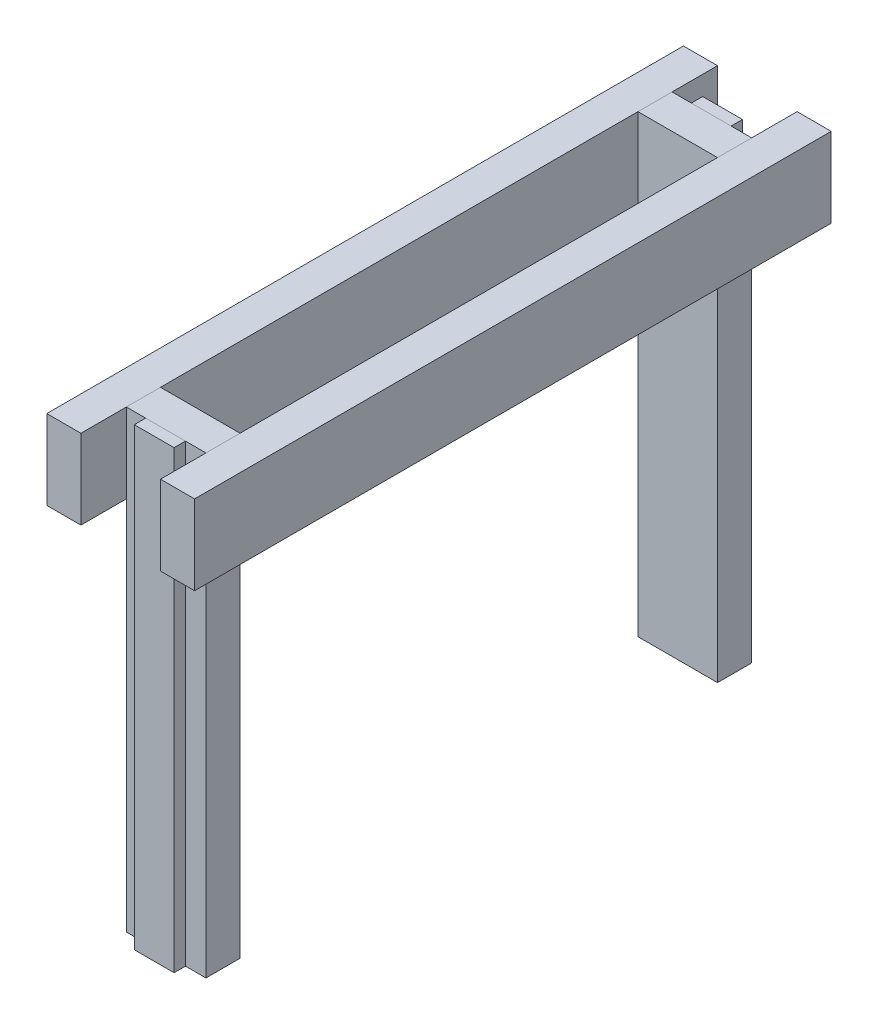
ISO-10303-21;
HEADER;
FILE_DESCRIPTION(('STEP AP214'),'2;1');
FILE_NAME('part.step','',(''),(''),'','','');
FILE_SCHEMA(('AUTOMOTIVE_DESIGN { 1 0 10303 214 1 1 1 1 }'));
ENDSEC;
DATA;
#1=APPLICATION_CONTEXT('core data for automotive mechanical design processes');
#2=APPLICATION_PROTOCOL_DEFINITION('international standard','automotive_design',2000,#1);
#3=PRODUCT_CONTEXT('',#1,'mechanical');
#4=PRODUCT('Part','Part','',(#3));
#5=PRODUCT_RELATED_PRODUCT_CATEGORY('part','',(#4));
#6=PRODUCT_DEFINITION_FORMATION('','',#4);
#7=PRODUCT_DEFINITION_CONTEXT('part definition',#1,'design');
#8=PRODUCT_DEFINITION('design','',#6,#7);
#9=PRODUCT_DEFINITION_SHAPE('','',#8);
#10=(LENGTH_UNIT() NAMED_UNIT(*) SI_UNIT(.MILLI.,.METRE.));
#11=(NAMED_UNIT(*) PLANE_ANGLE_UNIT() SI_UNIT($,.RADIAN.));
#12=(NAMED_UNIT(*) SI_UNIT($,.STERADIAN.) SOLID_ANGLE_UNIT());
#13=UNCERTAINTY_MEASURE_WITH_UNIT(LENGTH_MEASURE(1.E-05),#10,'distance_accuracy_value','');
#14=(GEOMETRIC_REPRESENTATION_CONTEXT(3) GLOBAL_UNCERTAINTY_ASSIGNED_CONTEXT((#13)) GLOBAL_UNIT_ASSIGNED_CONTEXT((#10,
#11,#12)) REPRESENTATION_CONTEXT('',''));
#15=CARTESIAN_POINT('',(0.,0.,0.));
#16=DIRECTION('',(0.,0.,1.));
#17=DIRECTION('',(1.,0.,0.));
#18=AXIS2_PLACEMENT_3D('',#15,#16,#17);
#19=CARTESIAN_POINT('',(21.5492445973489,-508.,-317.5));
#20=DIRECTION('',(0.,1.,0.));
#21=DIRECTION('',(0.,0.,-1.));
#22=AXIS2_PLACEMENT_3D('',#19,#20,#21);
#23=PLANE('',#22);
#24=DIRECTION('',(1.,0.,0.));
#25=VECTOR('',#24,1.);
#26=CARTESIAN_POINT('',(21.5492445973489,-508.,-304.8));
#27=LINE('',#26,#25);
#28=CARTESIAN_POINT('',(-22.9007554026511,-508.,-304.8));
#29=VERTEX_POINT('',#28);
#30=CARTESIAN_POINT('',(21.5492445973489,-508.,-304.8));
#31=VERTEX_POINT('',#30);
#32=EDGE_CURVE('E109',#29,#31,#27,.T.);
#33=ORIENTED_EDGE('',*,*,#32,.F.);
#34=DIRECTION('',(0.,0.,1.));
#35=VECTOR('',#34,1.);
#36=CARTESIAN_POINT('',(-22.9007554026511,-508.,-317.5));
#37=LINE('',#36,#35);
#38=CARTESIAN_POINT('',(-22.9007554026511,-508.,-317.5));
#39=VERTEX_POINT('',#38);
#40=EDGE_CURVE('E108',#39,#29,#37,.T.);
#41=ORIENTED_EDGE('',*,*,#40,.F.);
#42=DIRECTION('',(1.,0.,0.));
#43=VECTOR('',#42,1.);
#44=CARTESIAN_POINT('',(21.5492445973489,-508.,-317.5));
#45=LINE('',#44,#43);
#46=CARTESIAN_POINT('',(21.5492445973489,-508.,-317.5));
#47=VERTEX_POINT('',#46);
#48=EDGE_CURVE('E103',#39,#47,#45,.T.);
#49=ORIENTED_EDGE('',*,*,#48,.T.);
#50=DIRECTION('',(0.,0.,1.));
#51=VECTOR('',#50,1.);
#52=CARTESIAN_POINT('',(21.5492445973489,-508.,-317.5));
#53=LINE('',#52,#51);
#54=EDGE_CURVE('E12',#47,#31,#53,.T.);
#55=ORIENTED_EDGE('',*,*,#54,.T.);
#56=EDGE_LOOP('',(#33,#41,#49,#55));
#57=FACE_BOUND('',#56,.T.);
#58=ADVANCED_FACE('F46',(#57),#23,.F.);
#59=CARTESIAN_POINT('',(21.5492445973489,-508.,-317.5));
#60=DIRECTION('',(-1.,0.,0.));
#61=DIRECTION('',(0.,-1.,0.));
#62=AXIS2_PLACEMENT_3D('',#59,#60,#61);
#63=PLANE('',#62);
#64=DIRECTION('',(0.,1.,0.));
#65=VECTOR('',#64,1.);
#66=CARTESIAN_POINT('',(21.5492445973489,-508.,-304.8));
#67=LINE('',#66,#65);
#68=CARTESIAN_POINT('',(21.5492445973489,0.,-304.8));
#69=VERTEX_POINT('',#68);
#70=EDGE_CURVE('E111',#31,#69,#67,.T.);
#71=ORIENTED_EDGE('',*,*,#70,.F.);
#72=ORIENTED_EDGE('',*,*,#54,.F.);
#73=DIRECTION('',(0.,1.,0.));
#74=VECTOR('',#73,1.);
#75=CARTESIAN_POINT('',(21.5492445973489,-508.,-317.5));
#76=LINE('',#75,#74);
#77=CARTESIAN_POINT('',(21.5492445973489,0.,-317.5));
#78=VERTEX_POINT('',#77);
#79=EDGE_CURVE('E87',#47,#78,#76,.T.);
#80=ORIENTED_EDGE('',*,*,#79,.T.);
#81=DIRECTION('',(0.,0.,1.));
#82=VECTOR('',#81,1.);
#83=CARTESIAN_POINT('',(21.5492445973489,0.,-317.5));
#84=LINE('',#83,#82);
#85=EDGE_CURVE('E54',#78,#69,#84,.T.);
#86=ORIENTED_EDGE('',*,*,#85,.T.);
#87=EDGE_LOOP('',(#71,#72,#80,#86));
#88=FACE_BOUND('',#87,.T.);
#89=ADVANCED_FACE('F101',(#88),#63,.F.);
#90=CARTESIAN_POINT('',(21.5492445973489,0.,-317.5));
#91=DIRECTION('',(0.,-1.,0.));
#92=DIRECTION('',(0.,0.,1.));
#93=AXIS2_PLACEMENT_3D('',#90,#91,#92);
#94=PLANE('',#93);
#95=DIRECTION('',(-1.,0.,0.));
#96=VECTOR('',#95,1.);
#97=CARTESIAN_POINT('',(21.5492445973489,0.,-304.8));
#98=LINE('',#97,#96);
#99=CARTESIAN_POINT('',(-22.9007554026511,0.,-304.8));
#100=VERTEX_POINT('',#99);
#101=EDGE_CURVE('E97',#69,#100,#98,.T.);
#102=ORIENTED_EDGE('',*,*,#101,.F.);
#103=ORIENTED_EDGE('',*,*,#85,.F.);
#104=DIRECTION('',(-1.,0.,0.));
#105=VECTOR('',#104,1.);
#106=CARTESIAN_POINT('',(21.5492445973489,0.,-317.5));
#107=LINE('',#106,#105);
#108=CARTESIAN_POINT('',(-22.9007554026511,0.,-317.5));
#109=VERTEX_POINT('',#108);
#110=EDGE_CURVE('E90',#78,#109,#107,.T.);
#111=ORIENTED_EDGE('',*,*,#110,.T.);
#112=DIRECTION('',(0.,0.,1.));
#113=VECTOR('',#112,1.);
#114=CARTESIAN_POINT('',(-22.9007554026511,0.,-317.5));
#115=LINE('',#114,#113);
#116=EDGE_CURVE('E100',#109,#100,#115,.T.);
#117=ORIENTED_EDGE('',*,*,#116,.T.);
#118=EDGE_LOOP('',(#102,#103,#111,#117));
#119=FACE_BOUND('',#118,.T.);
#120=ADVANCED_FACE('F96',(#119),#94,.F.);
#121=CARTESIAN_POINT('',(-22.9007554026511,-508.,-317.5));
#122=DIRECTION('',(1.,0.,0.));
#123=DIRECTION('',(0.,0.,1.));
#124=AXIS2_PLACEMENT_3D('',#121,#122,#123);
#125=PLANE('',#124);
#126=DIRECTION('',(0.,-1.,0.));
#127=VECTOR('',#126,1.);
#128=CARTESIAN_POINT('',(-22.9007554026511,-508.,-304.8));
#129=LINE('',#128,#127);
#130=EDGE_CURVE('E76',#100,#29,#129,.T.);
#131=ORIENTED_EDGE('',*,*,#130,.F.);
#132=ORIENTED_EDGE('',*,*,#116,.F.);
#133=DIRECTION('',(0.,-1.,0.));
#134=VECTOR('',#133,1.);
#135=CARTESIAN_POINT('',(-22.9007554026511,-508.,-317.5));
#136=LINE('',#135,#134);
#137=EDGE_CURVE('E62',#109,#39,#136,.T.);
#138=ORIENTED_EDGE('',*,*,#137,.T.);
#139=ORIENTED_EDGE('',*,*,#40,.T.);
#140=EDGE_LOOP('',(#131,#132,#138,#139));
#141=FACE_BOUND('',#140,.T.);
#142=ADVANCED_FACE('F120',(#141),#125,.F.);
#143=CARTESIAN_POINT('',(0.,0.,-317.5));
#144=DIRECTION('',(0.,0.,1.));
#145=DIRECTION('',(-1.,0.,0.));
#146=AXIS2_PLACEMENT_3D('',#143,#144,#145);
#147=PLANE('',#146);
#148=ORIENTED_EDGE('',*,*,#48,.F.);
#149=ORIENTED_EDGE('',*,*,#137,.F.);
#150=ORIENTED_EDGE('',*,*,#110,.F.);
#151=ORIENTED_EDGE('',*,*,#79,.F.);
#152=EDGE_LOOP('',(#148,#149,#150,#151));
#153=FACE_BOUND('',#152,.T.);
#154=ADVANCED_FACE('F92',(#153),#147,.F.);
#155=CARTESIAN_POINT('',(0.,0.,-304.8));
#156=DIRECTION('',(0.,0.,1.));
#157=DIRECTION('',(-1.,0.,0.));
#158=AXIS2_PLACEMENT_3D('',#155,#156,#157);
#159=PLANE('',#158);
#160=ORIENTED_EDGE('',*,*,#32,.T.);
#161=ORIENTED_EDGE('',*,*,#70,.T.);
#162=ORIENTED_EDGE('',*,*,#101,.T.);
#163=ORIENTED_EDGE('',*,*,#130,.T.);
#164=EDGE_LOOP('',(#160,#161,#162,#163));
#165=FACE_BOUND('',#164,.T.);
#166=ADVANCED_FACE('F116',(#165),#159,.T.);
#167=CLOSED_SHELL('',(#58,#89,#120,#142,#154,#166));
#168=MANIFOLD_SOLID_BREP('B2',#167);
#169=CARTESIAN_POINT('',(21.5492445973489,-508.,317.5));
#170=DIRECTION('',(0.,1.,0.));
#171=DIRECTION('',(0.,0.,1.));
#172=AXIS2_PLACEMENT_3D('',#169,#170,#171);
#173=PLANE('',#172);
#174=DIRECTION('',(1.,0.,0.));
#175=VECTOR('',#174,1.);
#176=CARTESIAN_POINT('',(21.5492445973489,-508.,304.8));
#177=LINE('',#176,#175);
#178=CARTESIAN_POINT('',(-22.9007554026511,-508.,304.8));
#179=VERTEX_POINT('',#178);
#180=CARTESIAN_POINT('',(21.5492445973489,-508.,304.8));
#181=VERTEX_POINT('',#180);
#182=EDGE_CURVE('E255',#179,#181,#177,.T.);
#183=ORIENTED_EDGE('',*,*,#182,.T.);
#184=DIRECTION('',(0.,0.,-1.));
#185=VECTOR('',#184,1.);
#186=CARTESIAN_POINT('',(21.5492445973489,-508.,317.5));
#187=LINE('',#186,#185);
#188=CARTESIAN_POINT('',(21.5492445973489,-508.,317.5));
#189=VERTEX_POINT('',#188);
#190=EDGE_CURVE('E44',#189,#181,#187,.T.);
#191=ORIENTED_EDGE('',*,*,#190,.F.);
#192=DIRECTION('',(1.,0.,0.));
#193=VECTOR('',#192,1.);
#194=CARTESIAN_POINT('',(21.5492445973489,-508.,317.5));
#195=LINE('',#194,#193);
#196=CARTESIAN_POINT('',(-22.9007554026511,-508.,317.5));
#197=VERTEX_POINT('',#196);
#198=EDGE_CURVE('E243',#197,#189,#195,.T.);
#199=ORIENTED_EDGE('',*,*,#198,.F.);
#200=DIRECTION('',(0.,0.,-1.));
#201=VECTOR('',#200,1.);
#202=CARTESIAN_POINT('',(-22.9007554026511,-508.,317.5));
#203=LINE('',#202,#201);
#204=EDGE_CURVE('E251',#197,#179,#203,.T.);
#205=ORIENTED_EDGE('',*,*,#204,.T.);
#206=EDGE_LOOP('',(#183,#191,#199,#205));
#207=FACE_BOUND('',#206,.T.);
#208=ADVANCED_FACE('F192',(#207),#173,.F.);
#209=CARTESIAN_POINT('',(21.5492445973489,-508.,317.5));
#210=DIRECTION('',(-1.,0.,0.));
#211=DIRECTION('',(0.,-1.,0.));
#212=AXIS2_PLACEMENT_3D('',#209,#210,#211);
#213=PLANE('',#212);
#214=DIRECTION('',(0.,1.,0.));
#215=VECTOR('',#214,1.);
#216=CARTESIAN_POINT('',(21.5492445973489,-508.,304.8));
#217=LINE('',#216,#215);
#218=CARTESIAN_POINT('',(21.5492445973489,0.,304.8));
#219=VERTEX_POINT('',#218);
#220=EDGE_CURVE('E247',#181,#219,#217,.T.);
#221=ORIENTED_EDGE('',*,*,#220,.T.);
#222=DIRECTION('',(0.,0.,-1.));
#223=VECTOR('',#222,1.);
#224=CARTESIAN_POINT('',(21.5492445973489,0.,317.5));
#225=LINE('',#224,#223);
#226=CARTESIAN_POINT('',(21.5492445973489,0.,317.5));
#227=VERTEX_POINT('',#226);
#228=EDGE_CURVE('E200',#227,#219,#225,.T.);
#229=ORIENTED_EDGE('',*,*,#228,.F.);
#230=DIRECTION('',(0.,1.,0.));
#231=VECTOR('',#230,1.);
#232=CARTESIAN_POINT('',(21.5492445973489,-508.,317.5));
#233=LINE('',#232,#231);
#234=EDGE_CURVE('E238',#189,#227,#233,.T.);
#235=ORIENTED_EDGE('',*,*,#234,.F.);
#236=ORIENTED_EDGE('',*,*,#190,.T.);
#237=EDGE_LOOP('',(#221,#229,#235,#236));
#238=FACE_BOUND('',#237,.T.);
#239=ADVANCED_FACE('F246',(#238),#213,.F.);
#240=CARTESIAN_POINT('',(21.5492445973489,0.,317.5));
#241=DIRECTION('',(0.,-1.,0.));
#242=DIRECTION('',(0.,0.,-1.));
#243=AXIS2_PLACEMENT_3D('',#240,#241,#242);
#244=PLANE('',#243);
#245=DIRECTION('',(-1.,0.,0.));
#246=VECTOR('',#245,1.);
#247=CARTESIAN_POINT('',(21.5492445973489,0.,304.8));
#248=LINE('',#247,#246);
#249=CARTESIAN_POINT('',(-22.9007554026511,0.,304.8));
#250=VERTEX_POINT('',#249);
#251=EDGE_CURVE('E225',#219,#250,#248,.T.);
#252=ORIENTED_EDGE('',*,*,#251,.T.);
#253=DIRECTION('',(0.,0.,-1.));
#254=VECTOR('',#253,1.);
#255=CARTESIAN_POINT('',(-22.9007554026511,0.,317.5));
#256=LINE('',#255,#254);
#257=CARTESIAN_POINT('',(-22.9007554026511,0.,317.5));
#258=VERTEX_POINT('',#257);
#259=EDGE_CURVE('E248',#258,#250,#256,.T.);
#260=ORIENTED_EDGE('',*,*,#259,.F.);
#261=DIRECTION('',(-1.,0.,0.));
#262=VECTOR('',#261,1.);
#263=CARTESIAN_POINT('',(21.5492445973489,0.,317.5));
#264=LINE('',#263,#262);
#265=EDGE_CURVE('E241',#227,#258,#264,.T.);
#266=ORIENTED_EDGE('',*,*,#265,.F.);
#267=ORIENTED_EDGE('',*,*,#228,.T.);
#268=EDGE_LOOP('',(#252,#260,#266,#267));
#269=FACE_BOUND('',#268,.T.);
#270=ADVANCED_FACE('F249',(#269),#244,.F.);
#271=CARTESIAN_POINT('',(-22.9007554026511,-508.,317.5));
#272=DIRECTION('',(1.,0.,0.));
#273=DIRECTION('',(0.,0.,-1.));
#274=AXIS2_PLACEMENT_3D('',#271,#272,#273);
#275=PLANE('',#274);
#276=DIRECTION('',(0.,-1.,0.));
#277=VECTOR('',#276,1.);
#278=CARTESIAN_POINT('',(-22.9007554026511,-508.,304.8));
#279=LINE('',#278,#277);
#280=EDGE_CURVE('E231',#250,#179,#279,.T.);
#281=ORIENTED_EDGE('',*,*,#280,.T.);
#282=ORIENTED_EDGE('',*,*,#204,.F.);
#283=DIRECTION('',(0.,-1.,0.));
#284=VECTOR('',#283,1.);
#285=CARTESIAN_POINT('',(-22.9007554026511,-508.,317.5));
#286=LINE('',#285,#284);
#287=EDGE_CURVE('E208',#258,#197,#286,.T.);
#288=ORIENTED_EDGE('',*,*,#287,.F.);
#289=ORIENTED_EDGE('',*,*,#259,.T.);
#290=EDGE_LOOP('',(#281,#282,#288,#289));
#291=FACE_BOUND('',#290,.T.);
#292=ADVANCED_FACE('F262',(#291),#275,.F.);
#293=CARTESIAN_POINT('',(0.,0.,317.5));
#294=DIRECTION('',(0.,0.,-1.));
#295=DIRECTION('',(-1.,0.,0.));
#296=AXIS2_PLACEMENT_3D('',#293,#294,#295);
#297=PLANE('',#296);
#298=ORIENTED_EDGE('',*,*,#198,.T.);
#299=ORIENTED_EDGE('',*,*,#234,.T.);
#300=ORIENTED_EDGE('',*,*,#265,.T.);
#301=ORIENTED_EDGE('',*,*,#287,.T.);
#302=EDGE_LOOP('',(#298,#299,#300,#301));
#303=FACE_BOUND('',#302,.T.);
#304=ADVANCED_FACE('F239',(#303),#297,.F.);
#305=CARTESIAN_POINT('',(0.,0.,304.8));
#306=DIRECTION('',(0.,0.,-1.));
#307=DIRECTION('',(-1.,0.,0.));
#308=AXIS2_PLACEMENT_3D('',#305,#306,#307);
#309=PLANE('',#308);
#310=ORIENTED_EDGE('',*,*,#182,.F.);
#311=ORIENTED_EDGE('',*,*,#280,.F.);
#312=ORIENTED_EDGE('',*,*,#251,.F.);
#313=ORIENTED_EDGE('',*,*,#220,.F.);
#314=EDGE_LOOP('',(#310,#311,#312,#313));
#315=FACE_BOUND('',#314,.T.);
#316=ADVANCED_FACE('F265',(#315),#309,.T.);
#317=CLOSED_SHELL('',(#208,#239,#270,#292,#304,#316));
#318=MANIFOLD_SOLID_BREP('B6',#317);
#319=CARTESIAN_POINT('',(-82.5500000000002,-88.9,355.6));
#320=DIRECTION('',(0.,1.,0.));
#321=DIRECTION('',(0.,0.,1.));
#322=AXIS2_PLACEMENT_3D('',#319,#320,#321);
#323=PLANE('',#322);
#324=DIRECTION('',(0.,0.,-1.));
#325=VECTOR('',#324,1.);
#326=CARTESIAN_POINT('',(-44.4500000000002,-88.9,355.6));
#327=LINE('',#326,#325);
#328=CARTESIAN_POINT('',(-44.4500000000002,-88.9,355.6));
#329=VERTEX_POINT('',#328);
#330=CARTESIAN_POINT('',(-44.4499999999999,-88.9,-355.6));
#331=VERTEX_POINT('',#330);
#332=EDGE_CURVE('E389',#329,#331,#327,.T.);
#333=ORIENTED_EDGE('',*,*,#332,.F.);
#334=DIRECTION('',(1.,0.,0.));
#335=VECTOR('',#334,1.);
#336=CARTESIAN_POINT('',(-82.5500000000002,-88.9,355.6));
#337=LINE('',#336,#335);
#338=CARTESIAN_POINT('',(-82.5500000000002,-88.9,355.6));
#339=VERTEX_POINT('',#338);
#340=EDGE_CURVE('E388',#339,#329,#337,.T.);
#341=ORIENTED_EDGE('',*,*,#340,.F.);
#342=DIRECTION('',(0.,0.,-1.));
#343=VECTOR('',#342,1.);
#344=CARTESIAN_POINT('',(-82.5500000000002,-88.9,355.6));
#345=LINE('',#344,#343);
#346=CARTESIAN_POINT('',(-82.5499999999999,-88.9,-355.6));
#347=VERTEX_POINT('',#346);
#348=EDGE_CURVE('E383',#339,#347,#345,.T.);
#349=ORIENTED_EDGE('',*,*,#348,.T.);
#350=DIRECTION('',(1.,0.,0.));
#351=VECTOR('',#350,1.);
#352=CARTESIAN_POINT('',(-82.5499999999999,-88.9,-355.6));
#353=LINE('',#352,#351);
#354=EDGE_CURVE('E190',#347,#331,#353,.T.);
#355=ORIENTED_EDGE('',*,*,#354,.T.);
#356=EDGE_LOOP('',(#333,#341,#349,#355));
#357=FACE_BOUND('',#356,.T.);
#358=ADVANCED_FACE('F326',(#357),#323,.F.);
#359=CARTESIAN_POINT('',(-82.5499999999999,-88.9,-355.6));
#360=DIRECTION('',(0.,0.,1.));
#361=DIRECTION('',(-1.,0.,0.));
#362=AXIS2_PLACEMENT_3D('',#359,#360,#361);
#363=PLANE('',#362);
#364=DIRECTION('',(0.,1.,0.));
#365=VECTOR('',#364,1.);
#366=CARTESIAN_POINT('',(-44.4499999999999,-88.9,-355.6));
#367=LINE('',#366,#365);
#368=CARTESIAN_POINT('',(-44.4499999999999,0.,-355.6));
#369=VERTEX_POINT('',#368);
#370=EDGE_CURVE('E391',#331,#369,#367,.T.);
#371=ORIENTED_EDGE('',*,*,#370,.F.);
#372=ORIENTED_EDGE('',*,*,#354,.F.);
#373=DIRECTION('',(0.,1.,0.));
#374=VECTOR('',#373,1.);
#375=CARTESIAN_POINT('',(-82.5499999999999,-88.9,-355.6));
#376=LINE('',#375,#374);
#377=CARTESIAN_POINT('',(-82.5499999999999,0.,-355.6));
#378=VERTEX_POINT('',#377);
#379=EDGE_CURVE('E367',#347,#378,#376,.T.);
#380=ORIENTED_EDGE('',*,*,#379,.T.);
#381=DIRECTION('',(1.,0.,0.));
#382=VECTOR('',#381,1.);
#383=CARTESIAN_POINT('',(-82.5499999999999,0.,-355.6));
#384=LINE('',#383,#382);
#385=EDGE_CURVE('E334',#378,#369,#384,.T.);
#386=ORIENTED_EDGE('',*,*,#385,.T.);
#387=EDGE_LOOP('',(#371,#372,#380,#386));
#388=FACE_BOUND('',#387,.T.);
#389=ADVANCED_FACE('F381',(#388),#363,.F.);
#390=CARTESIAN_POINT('',(-82.5500000000002,0.,355.6));
#391=DIRECTION('',(0.,-1.,0.));
#392=DIRECTION('',(0.,0.,-1.));
#393=AXIS2_PLACEMENT_3D('',#390,#391,#392);
#394=PLANE('',#393);
#395=DIRECTION('',(0.,0.,1.));
#396=VECTOR('',#395,1.);
#397=CARTESIAN_POINT('',(-44.4500000000002,0.,355.6));
#398=LINE('',#397,#396);
#399=CARTESIAN_POINT('',(-44.4500000000002,0.,355.6));
#400=VERTEX_POINT('',#399);
#401=EDGE_CURVE('E377',#369,#400,#398,.T.);
#402=ORIENTED_EDGE('',*,*,#401,.F.);
#403=ORIENTED_EDGE('',*,*,#385,.F.);
#404=DIRECTION('',(0.,0.,1.));
#405=VECTOR('',#404,1.);
#406=CARTESIAN_POINT('',(-82.5500000000002,0.,355.6));
#407=LINE('',#406,#405);
#408=CARTESIAN_POINT('',(-82.5500000000002,0.,355.6));
#409=VERTEX_POINT('',#408);
#410=EDGE_CURVE('E370',#378,#409,#407,.T.);
#411=ORIENTED_EDGE('',*,*,#410,.T.);
#412=DIRECTION('',(1.,0.,0.));
#413=VECTOR('',#412,1.);
#414=CARTESIAN_POINT('',(-82.5500000000002,0.,355.6));
#415=LINE('',#414,#413);
#416=EDGE_CURVE('E380',#409,#400,#415,.T.);
#417=ORIENTED_EDGE('',*,*,#416,.T.);
#418=EDGE_LOOP('',(#402,#403,#411,#417));
#419=FACE_BOUND('',#418,.T.);
#420=ADVANCED_FACE('F376',(#419),#394,.F.);
#421=CARTESIAN_POINT('',(-82.5500000000002,-88.9,355.6));
#422=DIRECTION('',(0.,0.,-1.));
#423=DIRECTION('',(1.,0.,0.));
#424=AXIS2_PLACEMENT_3D('',#421,#422,#423);
#425=PLANE('',#424);
#426=DIRECTION('',(0.,-1.,0.));
#427=VECTOR('',#426,1.);
#428=CARTESIAN_POINT('',(-44.4500000000002,-88.9,355.6));
#429=LINE('',#428,#427);
#430=EDGE_CURVE('E356',#400,#329,#429,.T.);
#431=ORIENTED_EDGE('',*,*,#430,.F.);
#432=ORIENTED_EDGE('',*,*,#416,.F.);
#433=DIRECTION('',(0.,-1.,0.));
#434=VECTOR('',#433,1.);
#435=CARTESIAN_POINT('',(-82.5500000000002,-88.9,355.6));
#436=LINE('',#435,#434);
#437=EDGE_CURVE('E342',#409,#339,#436,.T.);
#438=ORIENTED_EDGE('',*,*,#437,.T.);
#439=ORIENTED_EDGE('',*,*,#340,.T.);
#440=EDGE_LOOP('',(#431,#432,#438,#439));
#441=FACE_BOUND('',#440,.T.);
#442=ADVANCED_FACE('F400',(#441),#425,.F.);
#443=CARTESIAN_POINT('',(-82.55,0.,0.));
#444=DIRECTION('',(-1.,0.,0.));
#445=DIRECTION('',(0.,0.,-1.));
#446=AXIS2_PLACEMENT_3D('',#443,#444,#445);
#447=PLANE('',#446);
#448=ORIENTED_EDGE('',*,*,#348,.F.);
#449=ORIENTED_EDGE('',*,*,#437,.F.);
#450=ORIENTED_EDGE('',*,*,#410,.F.);
#451=ORIENTED_EDGE('',*,*,#379,.F.);
#452=EDGE_LOOP('',(#448,#449,#450,#451));
#453=FACE_BOUND('',#452,.T.);
#454=ADVANCED_FACE('F372',(#453),#447,.T.);
#455=CARTESIAN_POINT('',(-44.45,0.,0.));
#456=DIRECTION('',(-1.,0.,0.));
#457=DIRECTION('',(0.,0.,-1.));
#458=AXIS2_PLACEMENT_3D('',#455,#456,#457);
#459=PLANE('',#458);
#460=ORIENTED_EDGE('',*,*,#332,.T.);
#461=ORIENTED_EDGE('',*,*,#370,.T.);
#462=ORIENTED_EDGE('',*,*,#401,.T.);
#463=ORIENTED_EDGE('',*,*,#430,.T.);
#464=EDGE_LOOP('',(#460,#461,#462,#463));
#465=FACE_BOUND('',#464,.T.);
#466=ADVANCED_FACE('F396',(#465),#459,.F.);
#467=CLOSED_SHELL('',(#358,#389,#420,#442,#454,#466));
#468=MANIFOLD_SOLID_BREP('B38',#467);
#469=CARTESIAN_POINT('',(82.5500000000002,-88.9,355.6));
#470=DIRECTION('',(0.,1.,0.));
#471=DIRECTION('',(0.,0.,1.));
#472=AXIS2_PLACEMENT_3D('',#469,#470,#471);
#473=PLANE('',#472);
#474=DIRECTION('',(0.,0.,-1.));
#475=VECTOR('',#474,1.);
#476=CARTESIAN_POINT('',(44.4500000000002,-88.9,355.6));
#477=LINE('',#476,#475);
#478=CARTESIAN_POINT('',(44.4500000000002,-88.9,355.6));
#479=VERTEX_POINT('',#478);
#480=CARTESIAN_POINT('',(44.4499999999999,-88.9,-355.6));
#481=VERTEX_POINT('',#480);
#482=EDGE_CURVE('E523',#479,#481,#477,.T.);
#483=ORIENTED_EDGE('',*,*,#482,.T.);
#484=DIRECTION('',(-1.,0.,0.));
#485=VECTOR('',#484,1.);
#486=CARTESIAN_POINT('',(82.5499999999999,-88.9,-355.6));
#487=LINE('',#486,#485);
#488=CARTESIAN_POINT('',(82.5499999999999,-88.9,-355.6));
#489=VERTEX_POINT('',#488);
#490=EDGE_CURVE('E324',#489,#481,#487,.T.);
#491=ORIENTED_EDGE('',*,*,#490,.F.);
#492=DIRECTION('',(0.,0.,-1.));
#493=VECTOR('',#492,1.);
#494=CARTESIAN_POINT('',(82.5500000000002,-88.9,355.6));
#495=LINE('',#494,#493);
#496=CARTESIAN_POINT('',(82.5500000000002,-88.9,355.6));
#497=VERTEX_POINT('',#496);
#498=EDGE_CURVE('E511',#497,#489,#495,.T.);
#499=ORIENTED_EDGE('',*,*,#498,.F.);
#500=DIRECTION('',(-1.,0.,0.));
#501=VECTOR('',#500,1.);
#502=CARTESIAN_POINT('',(82.5500000000002,-88.9,355.6));
#503=LINE('',#502,#501);
#504=EDGE_CURVE('E519',#497,#479,#503,.T.);
#505=ORIENTED_EDGE('',*,*,#504,.T.);
#506=EDGE_LOOP('',(#483,#491,#499,#505));
#507=FACE_BOUND('',#506,.T.);
#508=ADVANCED_FACE('F460',(#507),#473,.F.);
#509=CARTESIAN_POINT('',(82.5499999999999,-88.9,-355.6));
#510=DIRECTION('',(0.,0.,1.));
#511=DIRECTION('',(1.,0.,0.));
#512=AXIS2_PLACEMENT_3D('',#509,#510,#511);
#513=PLANE('',#512);
#514=DIRECTION('',(0.,1.,0.));
#515=VECTOR('',#514,1.);
#516=CARTESIAN_POINT('',(44.4499999999999,-88.9,-355.6));
#517=LINE('',#516,#515);
#518=CARTESIAN_POINT('',(44.4499999999999,0.,-355.6));
#519=VERTEX_POINT('',#518);
#520=EDGE_CURVE('E515',#481,#519,#517,.T.);
#521=ORIENTED_EDGE('',*,*,#520,.T.);
#522=DIRECTION('',(-1.,0.,0.));
#523=VECTOR('',#522,1.);
#524=CARTESIAN_POINT('',(82.5499999999999,0.,-355.6));
#525=LINE('',#524,#523);
#526=CARTESIAN_POINT('',(82.5499999999999,0.,-355.6));
#527=VERTEX_POINT('',#526);
#528=EDGE_CURVE('E468',#527,#519,#525,.T.);
#529=ORIENTED_EDGE('',*,*,#528,.F.);
#530=DIRECTION('',(0.,1.,0.));
#531=VECTOR('',#530,1.);
#532=CARTESIAN_POINT('',(82.5499999999999,-88.9,-355.6));
#533=LINE('',#532,#531);
#534=EDGE_CURVE('E506',#489,#527,#533,.T.);
#535=ORIENTED_EDGE('',*,*,#534,.F.);
#536=ORIENTED_EDGE('',*,*,#490,.T.);
#537=EDGE_LOOP('',(#521,#529,#535,#536));
#538=FACE_BOUND('',#537,.T.);
#539=ADVANCED_FACE('F514',(#538),#513,.F.);
#540=CARTESIAN_POINT('',(82.5500000000002,0.,355.6));
#541=DIRECTION('',(0.,-1.,0.));
#542=DIRECTION('',(0.,0.,-1.));
#543=AXIS2_PLACEMENT_3D('',#540,#541,#542);
#544=PLANE('',#543);
#545=DIRECTION('',(0.,0.,1.));
#546=VECTOR('',#545,1.);
#547=CARTESIAN_POINT('',(44.4500000000002,0.,355.6));
#548=LINE('',#547,#546);
#549=CARTESIAN_POINT('',(44.4500000000002,0.,355.6));
#550=VERTEX_POINT('',#549);
#551=EDGE_CURVE('E493',#519,#550,#548,.T.);
#552=ORIENTED_EDGE('',*,*,#551,.T.);
#553=DIRECTION('',(-1.,0.,0.));
#554=VECTOR('',#553,1.);
#555=CARTESIAN_POINT('',(82.5500000000002,0.,355.6));
#556=LINE('',#555,#554);
#557=CARTESIAN_POINT('',(82.5500000000002,0.,355.6));
#558=VERTEX_POINT('',#557);
#559=EDGE_CURVE('E516',#558,#550,#556,.T.);
#560=ORIENTED_EDGE('',*,*,#559,.F.);
#561=DIRECTION('',(0.,0.,1.));
#562=VECTOR('',#561,1.);
#563=CARTESIAN_POINT('',(82.5500000000002,0.,355.6));
#564=LINE('',#563,#562);
#565=EDGE_CURVE('E509',#527,#558,#564,.T.);
#566=ORIENTED_EDGE('',*,*,#565,.F.);
#567=ORIENTED_EDGE('',*,*,#528,.T.);
#568=EDGE_LOOP('',(#552,#560,#566,#567));
#569=FACE_BOUND('',#568,.T.);
#570=ADVANCED_FACE('F517',(#569),#544,.F.);
#571=CARTESIAN_POINT('',(82.5500000000002,-88.9,355.6));
#572=DIRECTION('',(0.,0.,-1.));
#573=DIRECTION('',(-1.,0.,0.));
#574=AXIS2_PLACEMENT_3D('',#571,#572,#573);
#575=PLANE('',#574);
#576=DIRECTION('',(0.,-1.,0.));
#577=VECTOR('',#576,1.);
#578=CARTESIAN_POINT('',(44.4500000000002,-88.9,355.6));
#579=LINE('',#578,#577);
#580=EDGE_CURVE('E499',#550,#479,#579,.T.);
#581=ORIENTED_EDGE('',*,*,#580,.T.);
#582=ORIENTED_EDGE('',*,*,#504,.F.);
#583=DIRECTION('',(0.,-1.,0.));
#584=VECTOR('',#583,1.);
#585=CARTESIAN_POINT('',(82.5500000000002,-88.9,355.6));
#586=LINE('',#585,#584);
#587=EDGE_CURVE('E476',#558,#497,#586,.T.);
#588=ORIENTED_EDGE('',*,*,#587,.F.);
#589=ORIENTED_EDGE('',*,*,#559,.T.);
#590=EDGE_LOOP('',(#581,#582,#588,#589));
#591=FACE_BOUND('',#590,.T.);
#592=ADVANCED_FACE('F530',(#591),#575,.F.);
#593=CARTESIAN_POINT('',(82.55,0.,0.));
#594=DIRECTION('',(1.,0.,0.));
#595=DIRECTION('',(0.,0.,-1.));
#596=AXIS2_PLACEMENT_3D('',#593,#594,#595);
#597=PLANE('',#596);
#598=ORIENTED_EDGE('',*,*,#498,.T.);
#599=ORIENTED_EDGE('',*,*,#534,.T.);
#600=ORIENTED_EDGE('',*,*,#565,.T.);
#601=ORIENTED_EDGE('',*,*,#587,.T.);
#602=EDGE_LOOP('',(#598,#599,#600,#601));
#603=FACE_BOUND('',#602,.T.);
#604=ADVANCED_FACE('F507',(#603),#597,.T.);
#605=CARTESIAN_POINT('',(44.45,0.,0.));
#606=DIRECTION('',(1.,0.,0.));
#607=DIRECTION('',(0.,0.,-1.));
#608=AXIS2_PLACEMENT_3D('',#605,#606,#607);
#609=PLANE('',#608);
#610=ORIENTED_EDGE('',*,*,#482,.F.);
#611=ORIENTED_EDGE('',*,*,#580,.F.);
#612=ORIENTED_EDGE('',*,*,#551,.F.);
#613=ORIENTED_EDGE('',*,*,#520,.F.);
#614=EDGE_LOOP('',(#610,#611,#612,#613));
#615=FACE_BOUND('',#614,.T.);
#616=ADVANCED_FACE('F533',(#615),#609,.F.);
#617=CLOSED_SHELL('',(#508,#539,#570,#592,#604,#616));
#618=MANIFOLD_SOLID_BREP('B184',#617);
#619=CARTESIAN_POINT('',(44.45,-508.,-304.8));
#620=DIRECTION('',(1.,0.,0.));
#621=DIRECTION('',(0.,0.,1.));
#622=AXIS2_PLACEMENT_3D('',#619,#620,#621);
#623=PLANE('',#622);
#624=DIRECTION('',(0.,0.,1.));
#625=VECTOR('',#624,1.);
#626=CARTESIAN_POINT('',(44.45,0.,-304.8));
#627=LINE('',#626,#625);
#628=CARTESIAN_POINT('',(44.45,0.,-304.8));
#629=VERTEX_POINT('',#628);
#630=CARTESIAN_POINT('',(44.45,0.,-266.7));
#631=VERTEX_POINT('',#630);
#632=EDGE_CURVE('E657',#629,#631,#627,.T.);
#633=ORIENTED_EDGE('',*,*,#632,.T.);
#634=DIRECTION('',(0.,1.,0.));
#635=VECTOR('',#634,1.);
#636=CARTESIAN_POINT('',(44.45,-508.,-266.7));
#637=LINE('',#636,#635);
#638=CARTESIAN_POINT('',(44.45,-508.,-266.7));
#639=VERTEX_POINT('',#638);
#640=EDGE_CURVE('E596',#639,#631,#637,.T.);
#641=ORIENTED_EDGE('',*,*,#640,.F.);
#642=DIRECTION('',(0.,0.,1.));
#643=VECTOR('',#642,1.);
#644=CARTESIAN_POINT('',(44.45,-508.,-304.8));
#645=LINE('',#644,#643);
#646=CARTESIAN_POINT('',(44.45,-508.,-304.8));
#647=VERTEX_POINT('',#646);
#648=EDGE_CURVE('E646',#647,#639,#645,.T.);
#649=ORIENTED_EDGE('',*,*,#648,.F.);
#650=DIRECTION('',(0.,1.,0.));
#651=VECTOR('',#650,1.);
#652=CARTESIAN_POINT('',(44.45,-508.,-304.8));
#653=LINE('',#652,#651);
#654=EDGE_CURVE('E458',#647,#629,#653,.T.);
#655=ORIENTED_EDGE('',*,*,#654,.T.);
#656=EDGE_LOOP('',(#633,#641,#649,#655));
#657=FACE_BOUND('',#656,.T.);
#658=ADVANCED_FACE('F593',(#657),#623,.T.);
#659=CARTESIAN_POINT('',(-44.45,-508.,-304.8));
#660=DIRECTION('',(0.,0.,-1.));
#661=DIRECTION('',(1.,0.,0.));
#662=AXIS2_PLACEMENT_3D('',#659,#660,#661);
#663=PLANE('',#662);
#664=DIRECTION('',(1.,0.,0.));
#665=VECTOR('',#664,1.);
#666=CARTESIAN_POINT('',(-44.45,0.,-304.8));
#667=LINE('',#666,#665);
#668=CARTESIAN_POINT('',(-44.45,0.,-304.8));
#669=VERTEX_POINT('',#668);
#670=EDGE_CURVE('E634',#669,#629,#667,.T.);
#671=ORIENTED_EDGE('',*,*,#670,.T.);
#672=ORIENTED_EDGE('',*,*,#654,.F.);
#673=DIRECTION('',(1.,0.,0.));
#674=VECTOR('',#673,1.);
#675=CARTESIAN_POINT('',(-44.45,-508.,-304.8));
#676=LINE('',#675,#674);
#677=CARTESIAN_POINT('',(-44.45,-508.,-304.8));
#678=VERTEX_POINT('',#677);
#679=EDGE_CURVE('E611',#678,#647,#676,.T.);
#680=ORIENTED_EDGE('',*,*,#679,.F.);
#681=DIRECTION('',(0.,1.,0.));
#682=VECTOR('',#681,1.);
#683=CARTESIAN_POINT('',(-44.45,-508.,-304.8));
#684=LINE('',#683,#682);
#685=EDGE_CURVE('E602',#678,#669,#684,.T.);
#686=ORIENTED_EDGE('',*,*,#685,.T.);
#687=EDGE_LOOP('',(#671,#672,#680,#686));
#688=FACE_BOUND('',#687,.T.);
#689=ADVANCED_FACE('F663',(#688),#663,.T.);
#690=CARTESIAN_POINT('',(-44.45,-508.,-304.8));
#691=DIRECTION('',(-1.,0.,0.));
#692=DIRECTION('',(0.,0.,-1.));
#693=AXIS2_PLACEMENT_3D('',#690,#691,#692);
#694=PLANE('',#693);
#695=DIRECTION('',(0.,0.,-1.));
#696=VECTOR('',#695,1.);
#697=CARTESIAN_POINT('',(-44.45,0.,-304.8));
#698=LINE('',#697,#696);
#699=CARTESIAN_POINT('',(-44.45,0.,-266.7));
#700=VERTEX_POINT('',#699);
#701=EDGE_CURVE('E628',#700,#669,#698,.T.);
#702=ORIENTED_EDGE('',*,*,#701,.T.);
#703=ORIENTED_EDGE('',*,*,#685,.F.);
#704=DIRECTION('',(0.,0.,-1.));
#705=VECTOR('',#704,1.);
#706=CARTESIAN_POINT('',(-44.45,-508.,-304.8));
#707=LINE('',#706,#705);
#708=CARTESIAN_POINT('',(-44.45,-508.,-266.7));
#709=VERTEX_POINT('',#708);
#710=EDGE_CURVE('E644',#709,#678,#707,.T.);
#711=ORIENTED_EDGE('',*,*,#710,.F.);
#712=DIRECTION('',(0.,1.,0.));
#713=VECTOR('',#712,1.);
#714=CARTESIAN_POINT('',(-44.45,-508.,-266.7));
#715=LINE('',#714,#713);
#716=EDGE_CURVE('E649',#709,#700,#715,.T.);
#717=ORIENTED_EDGE('',*,*,#716,.T.);
#718=EDGE_LOOP('',(#702,#703,#711,#717));
#719=FACE_BOUND('',#718,.T.);
#720=ADVANCED_FACE('F652',(#719),#694,.T.);
#721=CARTESIAN_POINT('',(-44.45,-508.,-266.7));
#722=DIRECTION('',(0.,0.,1.));
#723=DIRECTION('',(-1.,0.,0.));
#724=AXIS2_PLACEMENT_3D('',#721,#722,#723);
#725=PLANE('',#724);
#726=DIRECTION('',(-1.,0.,0.));
#727=VECTOR('',#726,1.);
#728=CARTESIAN_POINT('',(-44.45,0.,-266.7));
#729=LINE('',#728,#727);
#730=EDGE_CURVE('E651',#631,#700,#729,.T.);
#731=ORIENTED_EDGE('',*,*,#730,.T.);
#732=ORIENTED_EDGE('',*,*,#716,.F.);
#733=DIRECTION('',(-1.,0.,0.));
#734=VECTOR('',#733,1.);
#735=CARTESIAN_POINT('',(-44.45,-508.,-266.7));
#736=LINE('',#735,#734);
#737=EDGE_CURVE('E641',#639,#709,#736,.T.);
#738=ORIENTED_EDGE('',*,*,#737,.F.);
#739=ORIENTED_EDGE('',*,*,#640,.T.);
#740=EDGE_LOOP('',(#731,#732,#738,#739));
#741=FACE_BOUND('',#740,.T.);
#742=ADVANCED_FACE('F650',(#741),#725,.T.);
#743=CARTESIAN_POINT('',(0.,-508.,0.));
#744=DIRECTION('',(0.,-1.,0.));
#745=DIRECTION('',(0.,0.,1.));
#746=AXIS2_PLACEMENT_3D('',#743,#744,#745);
#747=PLANE('',#746);
#748=ORIENTED_EDGE('',*,*,#648,.T.);
#749=ORIENTED_EDGE('',*,*,#737,.T.);
#750=ORIENTED_EDGE('',*,*,#710,.T.);
#751=ORIENTED_EDGE('',*,*,#679,.T.);
#752=EDGE_LOOP('',(#748,#749,#750,#751));
#753=FACE_BOUND('',#752,.T.);
#754=ADVANCED_FACE('F642',(#753),#747,.T.);
#755=CARTESIAN_POINT('',(0.,0.,0.));
#756=DIRECTION('',(0.,-1.,0.));
#757=DIRECTION('',(0.,0.,1.));
#758=AXIS2_PLACEMENT_3D('',#755,#756,#757);
#759=PLANE('',#758);
#760=ORIENTED_EDGE('',*,*,#632,.F.);
#761=ORIENTED_EDGE('',*,*,#670,.F.);
#762=ORIENTED_EDGE('',*,*,#701,.F.);
#763=ORIENTED_EDGE('',*,*,#730,.F.);
#764=EDGE_LOOP('',(#760,#761,#762,#763));
#765=FACE_BOUND('',#764,.T.);
#766=ADVANCED_FACE('F666',(#765),#759,.F.);
#767=CLOSED_SHELL('',(#658,#689,#720,#742,#754,#766));
#768=MANIFOLD_SOLID_BREP('B318',#767);
#769=CARTESIAN_POINT('',(44.45,-508.,304.8));
#770=DIRECTION('',(1.,0.,0.));
#771=DIRECTION('',(0.,0.,-1.));
#772=AXIS2_PLACEMENT_3D('',#769,#770,#771);
#773=PLANE('',#772);
#774=DIRECTION('',(0.,0.,-1.));
#775=VECTOR('',#774,1.);
#776=CARTESIAN_POINT('',(44.45,0.,304.8));
#777=LINE('',#776,#775);
#778=CARTESIAN_POINT('',(44.45,0.,304.8));
#779=VERTEX_POINT('',#778);
#780=CARTESIAN_POINT('',(44.45,0.,266.7));
#781=VERTEX_POINT('',#780);
#782=EDGE_CURVE('E781',#779,#781,#777,.T.);
#783=ORIENTED_EDGE('',*,*,#782,.F.);
#784=DIRECTION('',(0.,1.,0.));
#785=VECTOR('',#784,1.);
#786=CARTESIAN_POINT('',(44.45,-508.,304.8));
#787=LINE('',#786,#785);
#788=CARTESIAN_POINT('',(44.45,-508.,304.8));
#789=VERTEX_POINT('',#788);
#790=EDGE_CURVE('E591',#789,#779,#787,.T.);
#791=ORIENTED_EDGE('',*,*,#790,.F.);
#792=DIRECTION('',(0.,0.,-1.));
#793=VECTOR('',#792,1.);
#794=CARTESIAN_POINT('',(44.45,-508.,304.8));
#795=LINE('',#794,#793);
#796=CARTESIAN_POINT('',(44.45,-508.,266.7));
#797=VERTEX_POINT('',#796);
#798=EDGE_CURVE('E775',#789,#797,#795,.T.);
#799=ORIENTED_EDGE('',*,*,#798,.T.);
#800=DIRECTION('',(0.,1.,0.));
#801=VECTOR('',#800,1.);
#802=CARTESIAN_POINT('',(44.45,-508.,266.7));
#803=LINE('',#802,#801);
#804=EDGE_CURVE('E720',#797,#781,#803,.T.);
#805=ORIENTED_EDGE('',*,*,#804,.T.);
#806=EDGE_LOOP('',(#783,#791,#799,#805));
#807=FACE_BOUND('',#806,.T.);
#808=ADVANCED_FACE('F717',(#807),#773,.T.);
#809=CARTESIAN_POINT('',(-44.45,-508.,304.8));
#810=DIRECTION('',(0.,0.,1.));
#811=DIRECTION('',(1.,0.,0.));
#812=AXIS2_PLACEMENT_3D('',#809,#810,#811);
#813=PLANE('',#812);
#814=DIRECTION('',(1.,0.,0.));
#815=VECTOR('',#814,1.);
#816=CARTESIAN_POINT('',(-44.45,0.,304.8));
#817=LINE('',#816,#815);
#818=CARTESIAN_POINT('',(-44.45,0.,304.8));
#819=VERTEX_POINT('',#818);
#820=EDGE_CURVE('E777',#819,#779,#817,.T.);
#821=ORIENTED_EDGE('',*,*,#820,.F.);
#822=DIRECTION('',(0.,1.,0.));
#823=VECTOR('',#822,1.);
#824=CARTESIAN_POINT('',(-44.45,-508.,304.8));
#825=LINE('',#824,#823);
#826=CARTESIAN_POINT('',(-44.45,-508.,304.8));
#827=VERTEX_POINT('',#826);
#828=EDGE_CURVE('E726',#827,#819,#825,.T.);
#829=ORIENTED_EDGE('',*,*,#828,.F.);
#830=DIRECTION('',(1.,0.,0.));
#831=VECTOR('',#830,1.);
#832=CARTESIAN_POINT('',(-44.45,-508.,304.8));
#833=LINE('',#832,#831);
#834=EDGE_CURVE('E772',#827,#789,#833,.T.);
#835=ORIENTED_EDGE('',*,*,#834,.T.);
#836=ORIENTED_EDGE('',*,*,#790,.T.);
#837=EDGE_LOOP('',(#821,#829,#835,#836));
#838=FACE_BOUND('',#837,.T.);
#839=ADVANCED_FACE('F791',(#838),#813,.T.);
#840=CARTESIAN_POINT('',(-44.45,-508.,304.8));
#841=DIRECTION('',(-1.,0.,0.));
#842=DIRECTION('',(0.,0.,1.));
#843=AXIS2_PLACEMENT_3D('',#840,#841,#842);
#844=PLANE('',#843);
#845=DIRECTION('',(0.,0.,1.));
#846=VECTOR('',#845,1.);
#847=CARTESIAN_POINT('',(-44.45,0.,304.8));
#848=LINE('',#847,#846);
#849=CARTESIAN_POINT('',(-44.45,0.,266.7));
#850=VERTEX_POINT('',#849);
#851=EDGE_CURVE('E767',#850,#819,#848,.T.);
#852=ORIENTED_EDGE('',*,*,#851,.F.);
#853=DIRECTION('',(0.,1.,0.));
#854=VECTOR('',#853,1.);
#855=CARTESIAN_POINT('',(-44.45,-508.,266.7));
#856=LINE('',#855,#854);
#857=CARTESIAN_POINT('',(-44.45,-508.,266.7));
#858=VERTEX_POINT('',#857);
#859=EDGE_CURVE('E762',#858,#850,#856,.T.);
#860=ORIENTED_EDGE('',*,*,#859,.F.);
#861=DIRECTION('',(0.,0.,1.));
#862=VECTOR('',#861,1.);
#863=CARTESIAN_POINT('',(-44.45,-508.,304.8));
#864=LINE('',#863,#862);
#865=EDGE_CURVE('E765',#858,#827,#864,.T.);
#866=ORIENTED_EDGE('',*,*,#865,.T.);
#867=ORIENTED_EDGE('',*,*,#828,.T.);
#868=EDGE_LOOP('',(#852,#860,#866,#867));
#869=FACE_BOUND('',#868,.T.);
#870=ADVANCED_FACE('F764',(#869),#844,.T.);
#871=CARTESIAN_POINT('',(-44.45,-508.,266.7));
#872=DIRECTION('',(0.,0.,-1.));
#873=DIRECTION('',(-1.,0.,0.));
#874=AXIS2_PLACEMENT_3D('',#871,#872,#873);
#875=PLANE('',#874);
#876=DIRECTION('',(-1.,0.,0.));
#877=VECTOR('',#876,1.);
#878=CARTESIAN_POINT('',(-44.45,0.,266.7));
#879=LINE('',#878,#877);
#880=EDGE_CURVE('E784',#781,#850,#879,.T.);
#881=ORIENTED_EDGE('',*,*,#880,.F.);
#882=ORIENTED_EDGE('',*,*,#804,.F.);
#883=DIRECTION('',(-1.,0.,0.));
#884=VECTOR('',#883,1.);
#885=CARTESIAN_POINT('',(-44.45,-508.,266.7));
#886=LINE('',#885,#884);
#887=EDGE_CURVE('E771',#797,#858,#886,.T.);
#888=ORIENTED_EDGE('',*,*,#887,.T.);
#889=ORIENTED_EDGE('',*,*,#859,.T.);
#890=EDGE_LOOP('',(#881,#882,#888,#889));
#891=FACE_BOUND('',#890,.T.);
#892=ADVANCED_FACE('F774',(#891),#875,.T.);
#893=CARTESIAN_POINT('',(0.,-508.,0.));
#894=DIRECTION('',(0.,-1.,0.));
#895=DIRECTION('',(0.,0.,-1.));
#896=AXIS2_PLACEMENT_3D('',#893,#894,#895);
#897=PLANE('',#896);
#898=ORIENTED_EDGE('',*,*,#798,.F.);
#899=ORIENTED_EDGE('',*,*,#834,.F.);
#900=ORIENTED_EDGE('',*,*,#865,.F.);
#901=ORIENTED_EDGE('',*,*,#887,.F.);
#902=EDGE_LOOP('',(#898,#899,#900,#901));
#903=FACE_BOUND('',#902,.T.);
#904=ADVANCED_FACE('F770',(#903),#897,.T.);
#905=CARTESIAN_POINT('',(0.,0.,0.));
#906=DIRECTION('',(0.,-1.,0.));
#907=DIRECTION('',(0.,0.,-1.));
#908=AXIS2_PLACEMENT_3D('',#905,#906,#907);
#909=PLANE('',#908);
#910=ORIENTED_EDGE('',*,*,#782,.T.);
#911=ORIENTED_EDGE('',*,*,#880,.T.);
#912=ORIENTED_EDGE('',*,*,#851,.T.);
#913=ORIENTED_EDGE('',*,*,#820,.T.);
#914=EDGE_LOOP('',(#910,#911,#912,#913));
#915=FACE_BOUND('',#914,.T.);
#916=ADVANCED_FACE('F790',(#915),#909,.F.);
#917=CLOSED_SHELL('',(#808,#839,#870,#892,#904,#916));
#918=MANIFOLD_SOLID_BREP('B452',#917);
#919=ADVANCED_BREP_SHAPE_REPRESENTATION('',(#18,#168,#318,#468,#618,#768,#918),#14);
#920=SHAPE_DEFINITION_REPRESENTATION(#9,#919);
ENDSEC;
END-ISO-10303-21;
